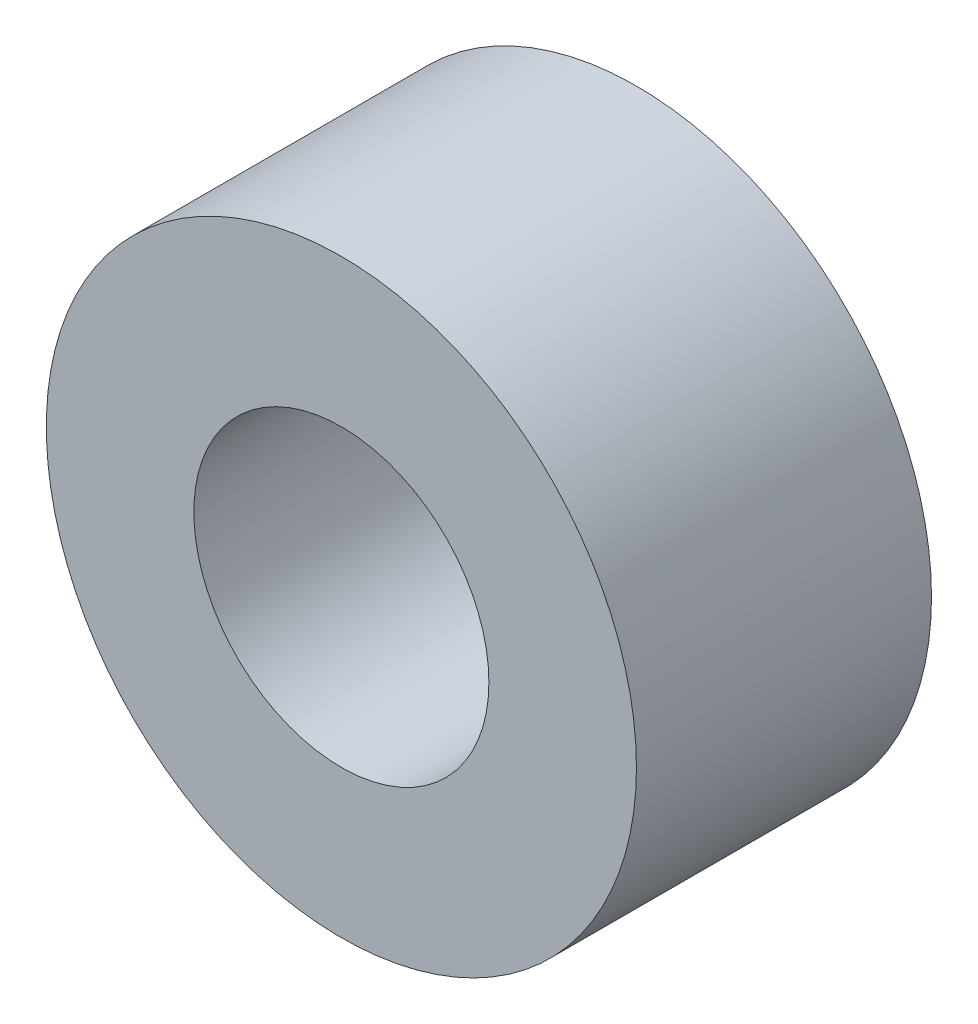
ISO-10303-21;
HEADER;
FILE_DESCRIPTION(('STEP AP214'),'2;1');
FILE_NAME('part.step','',(''),(''),'','','');
FILE_SCHEMA(('AUTOMOTIVE_DESIGN { 1 0 10303 214 1 1 1 1 }'));
ENDSEC;
DATA;
#1=APPLICATION_CONTEXT('core data for automotive mechanical design processes');
#2=APPLICATION_PROTOCOL_DEFINITION('international standard','automotive_design',2000,#1);
#3=PRODUCT_CONTEXT('',#1,'mechanical');
#4=PRODUCT('Part','Part','',(#3));
#5=PRODUCT_RELATED_PRODUCT_CATEGORY('part','',(#4));
#6=PRODUCT_DEFINITION_FORMATION('','',#4);
#7=PRODUCT_DEFINITION_CONTEXT('part definition',#1,'design');
#8=PRODUCT_DEFINITION('design','',#6,#7);
#9=PRODUCT_DEFINITION_SHAPE('','',#8);
#10=(LENGTH_UNIT() NAMED_UNIT(*) SI_UNIT(.MILLI.,.METRE.));
#11=(NAMED_UNIT(*) PLANE_ANGLE_UNIT() SI_UNIT($,.RADIAN.));
#12=(NAMED_UNIT(*) SI_UNIT($,.STERADIAN.) SOLID_ANGLE_UNIT());
#13=UNCERTAINTY_MEASURE_WITH_UNIT(LENGTH_MEASURE(1.E-05),#10,'distance_accuracy_value','');
#14=(GEOMETRIC_REPRESENTATION_CONTEXT(3) GLOBAL_UNCERTAINTY_ASSIGNED_CONTEXT((#13)) GLOBAL_UNIT_ASSIGNED_CONTEXT((#10,
#11,#12)) REPRESENTATION_CONTEXT('',''));
#15=CARTESIAN_POINT('',(0.,0.,0.));
#16=DIRECTION('',(0.,0.,1.));
#17=DIRECTION('',(1.,0.,0.));
#18=AXIS2_PLACEMENT_3D('',#15,#16,#17);
#19=CARTESIAN_POINT('',(-5.05898181868077,32.4813812691628,2.));
#20=DIRECTION('',(0.,0.,1.));
#21=DIRECTION('',(1.,0.,0.));
#22=AXIS2_PLACEMENT_3D('',#19,#20,#21);
#23=PLANE('',#22);
#24=CARTESIAN_POINT('',(-5.05898181868077,32.4813812691628,2.));
#25=DIRECTION('',(0.,0.,1.));
#26=DIRECTION('',(1.,0.,0.));
#27=AXIS2_PLACEMENT_3D('',#24,#25,#26);
#28=CIRCLE('',#27,2.);
#29=CARTESIAN_POINT('',(-3.05898181868077,32.4813812691628,2.));
#30=VERTEX_POINT('',#29);
#31=EDGE_CURVE('E10',#30,#30,#28,.T.);
#32=ORIENTED_EDGE('',*,*,#31,.T.);
#33=EDGE_LOOP('',(#32));
#34=FACE_BOUND('',#33,.T.);
#35=CARTESIAN_POINT('',(-5.05898181868077,32.4813812691628,2.));
#36=DIRECTION('',(0.,0.,1.));
#37=DIRECTION('',(1.,0.,0.));
#38=AXIS2_PLACEMENT_3D('',#35,#36,#37);
#39=CIRCLE('',#38,1.);
#40=CARTESIAN_POINT('',(-4.05898181868077,32.4813812691628,2.));
#41=VERTEX_POINT('',#40);
#42=EDGE_CURVE('E48',#41,#41,#39,.T.);
#43=ORIENTED_EDGE('',*,*,#42,.F.);
#44=EDGE_LOOP('',(#43));
#45=FACE_BOUND('',#44,.T.);
#46=ADVANCED_FACE('F37',(#34,#45),#23,.T.);
#47=CARTESIAN_POINT('',(-5.05898181868077,32.4813812691628,0.));
#48=DIRECTION('',(0.,0.,1.));
#49=DIRECTION('',(1.,0.,0.));
#50=AXIS2_PLACEMENT_3D('',#47,#48,#49);
#51=PLANE('',#50);
#52=CARTESIAN_POINT('',(-5.05898181868077,32.4813812691628,0.));
#53=DIRECTION('',(0.,0.,1.));
#54=DIRECTION('',(1.,0.,0.));
#55=AXIS2_PLACEMENT_3D('',#52,#53,#54);
#56=CIRCLE('',#55,2.);
#57=CARTESIAN_POINT('',(-3.05898181868077,32.4813812691628,0.));
#58=VERTEX_POINT('',#57);
#59=EDGE_CURVE('E41',#58,#58,#56,.T.);
#60=ORIENTED_EDGE('',*,*,#59,.F.);
#61=EDGE_LOOP('',(#60));
#62=FACE_BOUND('',#61,.T.);
#63=CARTESIAN_POINT('',(-5.05898181868077,32.4813812691628,0.));
#64=DIRECTION('',(0.,0.,1.));
#65=DIRECTION('',(1.,0.,0.));
#66=AXIS2_PLACEMENT_3D('',#63,#64,#65);
#67=CIRCLE('',#66,1.);
#68=CARTESIAN_POINT('',(-4.05898181868077,32.4813812691628,0.));
#69=VERTEX_POINT('',#68);
#70=EDGE_CURVE('E50',#69,#69,#67,.T.);
#71=ORIENTED_EDGE('',*,*,#70,.T.);
#72=EDGE_LOOP('',(#71));
#73=FACE_BOUND('',#72,.T.);
#74=ADVANCED_FACE('F60',(#62,#73),#51,.F.);
#75=CARTESIAN_POINT('',(-5.05898181868077,32.4813812691628,2.));
#76=DIRECTION('',(0.,0.,-1.));
#77=DIRECTION('',(-1.,0.,0.));
#78=AXIS2_PLACEMENT_3D('',#75,#76,#77);
#79=CYLINDRICAL_SURFACE('',#78,2.);
#80=ORIENTED_EDGE('',*,*,#31,.F.);
#81=EDGE_LOOP('',(#80));
#82=FACE_BOUND('',#81,.T.);
#83=ORIENTED_EDGE('',*,*,#59,.T.);
#84=EDGE_LOOP('',(#83));
#85=FACE_BOUND('',#84,.T.);
#86=ADVANCED_FACE('F39',(#82,#85),#79,.T.);
#87=CARTESIAN_POINT('',(-5.05898181868077,32.4813812691628,2.));
#88=DIRECTION('',(0.,0.,-1.));
#89=DIRECTION('',(-1.,0.,0.));
#90=AXIS2_PLACEMENT_3D('',#87,#88,#89);
#91=CYLINDRICAL_SURFACE('',#90,1.);
#92=ORIENTED_EDGE('',*,*,#42,.T.);
#93=EDGE_LOOP('',(#92));
#94=FACE_BOUND('',#93,.T.);
#95=ORIENTED_EDGE('',*,*,#70,.F.);
#96=EDGE_LOOP('',(#95));
#97=FACE_BOUND('',#96,.T.);
#98=ADVANCED_FACE('F56',(#94,#97),#91,.F.);
#99=CLOSED_SHELL('',(#46,#74,#86,#98));
#100=MANIFOLD_SOLID_BREP('B2',#99);
#101=ADVANCED_BREP_SHAPE_REPRESENTATION('',(#18,#100),#14);
#102=SHAPE_DEFINITION_REPRESENTATION(#9,#101);
ENDSEC;
END-ISO-10303-21;
